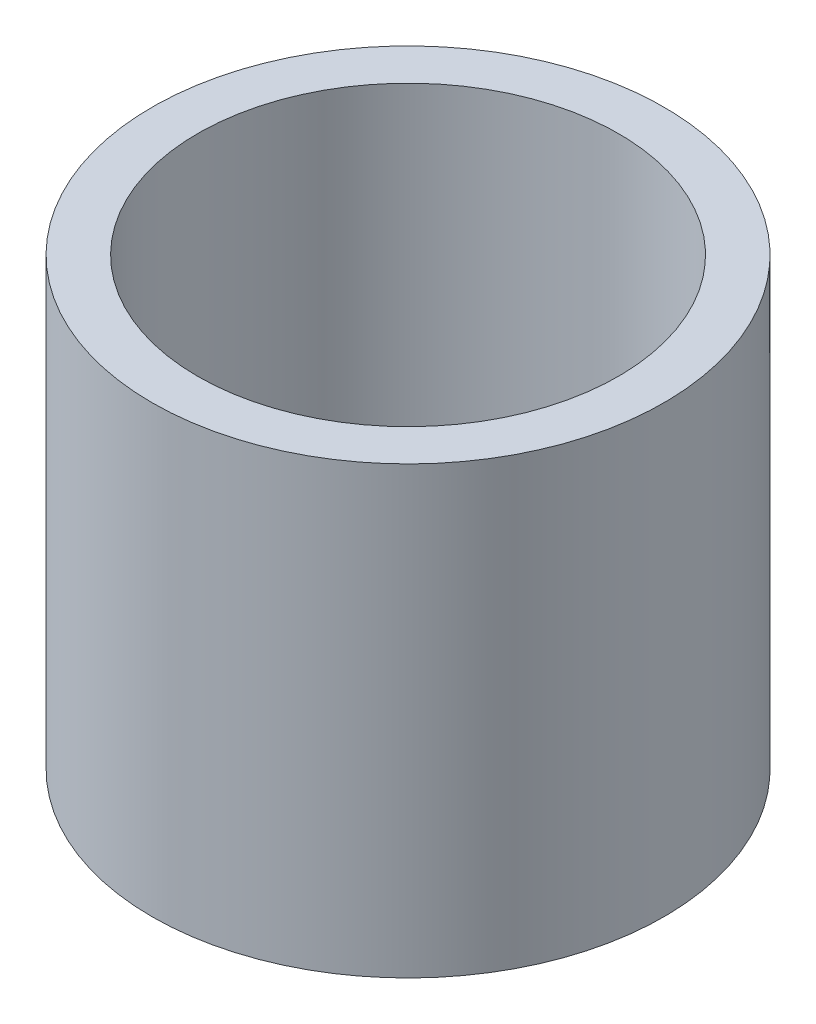
ISO-10303-21;
HEADER;
FILE_DESCRIPTION(('STEP AP214'),'2;1');
FILE_NAME('part.step','',(''),(''),'','','');
FILE_SCHEMA(('AUTOMOTIVE_DESIGN { 1 0 10303 214 1 1 1 1 }'));
ENDSEC;
DATA;
#1=APPLICATION_CONTEXT('core data for automotive mechanical design processes');
#2=APPLICATION_PROTOCOL_DEFINITION('international standard','automotive_design',2000,#1);
#3=PRODUCT_CONTEXT('',#1,'mechanical');
#4=PRODUCT('Part','Part','',(#3));
#5=PRODUCT_RELATED_PRODUCT_CATEGORY('part','',(#4));
#6=PRODUCT_DEFINITION_FORMATION('','',#4);
#7=PRODUCT_DEFINITION_CONTEXT('part definition',#1,'design');
#8=PRODUCT_DEFINITION('design','',#6,#7);
#9=PRODUCT_DEFINITION_SHAPE('','',#8);
#10=(LENGTH_UNIT() NAMED_UNIT(*) SI_UNIT(.MILLI.,.METRE.));
#11=(NAMED_UNIT(*) PLANE_ANGLE_UNIT() SI_UNIT($,.RADIAN.));
#12=(NAMED_UNIT(*) SI_UNIT($,.STERADIAN.) SOLID_ANGLE_UNIT());
#13=UNCERTAINTY_MEASURE_WITH_UNIT(LENGTH_MEASURE(1.E-05),#10,'distance_accuracy_value','');
#14=(GEOMETRIC_REPRESENTATION_CONTEXT(3) GLOBAL_UNCERTAINTY_ASSIGNED_CONTEXT((#13)) GLOBAL_UNIT_ASSIGNED_CONTEXT((#10,
#11,#12)) REPRESENTATION_CONTEXT('',''));
#15=CARTESIAN_POINT('',(0.,0.,0.));
#16=DIRECTION('',(0.,0.,1.));
#17=DIRECTION('',(1.,0.,0.));
#18=AXIS2_PLACEMENT_3D('',#15,#16,#17);
#19=CARTESIAN_POINT('',(0.,20.,0.));
#20=DIRECTION('',(0.,-1.,0.));
#21=DIRECTION('',(0.,0.,-1.));
#22=AXIS2_PLACEMENT_3D('',#19,#20,#21);
#23=CYLINDRICAL_SURFACE('',#22,11.5);
#24=CARTESIAN_POINT('',(0.,20.,0.));
#25=DIRECTION('',(0.,1.,0.));
#26=DIRECTION('',(0.,0.,1.));
#27=AXIS2_PLACEMENT_3D('',#24,#25,#26);
#28=CIRCLE('',#27,11.5);
#29=CARTESIAN_POINT('',(0.,20.,11.5));
#30=VERTEX_POINT('',#29);
#31=EDGE_CURVE('E10',#30,#30,#28,.T.);
#32=ORIENTED_EDGE('',*,*,#31,.F.);
#33=EDGE_LOOP('',(#32));
#34=FACE_BOUND('',#33,.T.);
#35=CARTESIAN_POINT('',(0.,0.,0.));
#36=DIRECTION('',(0.,1.,0.));
#37=DIRECTION('',(0.,0.,1.));
#38=AXIS2_PLACEMENT_3D('',#35,#36,#37);
#39=CIRCLE('',#38,11.5);
#40=CARTESIAN_POINT('',(0.,0.,11.5));
#41=VERTEX_POINT('',#40);
#42=EDGE_CURVE('E42',#41,#41,#39,.T.);
#43=ORIENTED_EDGE('',*,*,#42,.T.);
#44=EDGE_LOOP('',(#43));
#45=FACE_BOUND('',#44,.T.);
#46=ADVANCED_FACE('F39',(#34,#45),#23,.T.);
#47=CARTESIAN_POINT('',(0.,20.,0.));
#48=DIRECTION('',(0.,1.,0.));
#49=DIRECTION('',(0.,0.,1.));
#50=AXIS2_PLACEMENT_3D('',#47,#48,#49);
#51=PLANE('',#50);
#52=CARTESIAN_POINT('',(0.,20.,0.));
#53=DIRECTION('',(0.,1.,0.));
#54=DIRECTION('',(0.,0.,1.));
#55=AXIS2_PLACEMENT_3D('',#52,#53,#54);
#56=CIRCLE('',#55,9.45);
#57=CARTESIAN_POINT('',(0.,20.,9.45));
#58=VERTEX_POINT('',#57);
#59=EDGE_CURVE('E51',#58,#58,#56,.T.);
#60=ORIENTED_EDGE('',*,*,#59,.F.);
#61=EDGE_LOOP('',(#60));
#62=FACE_BOUND('',#61,.T.);
#63=ORIENTED_EDGE('',*,*,#31,.T.);
#64=EDGE_LOOP('',(#63));
#65=FACE_BOUND('',#64,.T.);
#66=ADVANCED_FACE('F66',(#62,#65),#51,.T.);
#67=CARTESIAN_POINT('',(0.,0.,0.));
#68=DIRECTION('',(0.,1.,0.));
#69=DIRECTION('',(0.,0.,1.));
#70=AXIS2_PLACEMENT_3D('',#67,#68,#69);
#71=PLANE('',#70);
#72=CARTESIAN_POINT('',(0.,0.,0.));
#73=DIRECTION('',(0.,1.,0.));
#74=DIRECTION('',(0.,0.,1.));
#75=AXIS2_PLACEMENT_3D('',#72,#73,#74);
#76=CIRCLE('',#75,9.45);
#77=CARTESIAN_POINT('',(0.,0.,9.45));
#78=VERTEX_POINT('',#77);
#79=EDGE_CURVE('E49',#78,#78,#76,.T.);
#80=ORIENTED_EDGE('',*,*,#79,.T.);
#81=EDGE_LOOP('',(#80));
#82=FACE_BOUND('',#81,.T.);
#83=ORIENTED_EDGE('',*,*,#42,.F.);
#84=EDGE_LOOP('',(#83));
#85=FACE_BOUND('',#84,.T.);
#86=ADVANCED_FACE('F57',(#82,#85),#71,.F.);
#87=CARTESIAN_POINT('',(0.,0.,0.));
#88=DIRECTION('',(0.,1.,0.));
#89=DIRECTION('',(0.,0.,1.));
#90=AXIS2_PLACEMENT_3D('',#87,#88,#89);
#91=CYLINDRICAL_SURFACE('',#90,9.45);
#92=ORIENTED_EDGE('',*,*,#79,.F.);
#93=EDGE_LOOP('',(#92));
#94=FACE_BOUND('',#93,.T.);
#95=ORIENTED_EDGE('',*,*,#59,.T.);
#96=EDGE_LOOP('',(#95));
#97=FACE_BOUND('',#96,.T.);
#98=ADVANCED_FACE('F60',(#94,#97),#91,.F.);
#99=CLOSED_SHELL('',(#46,#66,#86,#98));
#100=MANIFOLD_SOLID_BREP('B2',#99);
#101=ADVANCED_BREP_SHAPE_REPRESENTATION('',(#18,#100),#14);
#102=SHAPE_DEFINITION_REPRESENTATION(#9,#101);
ENDSEC;
END-ISO-10303-21;
